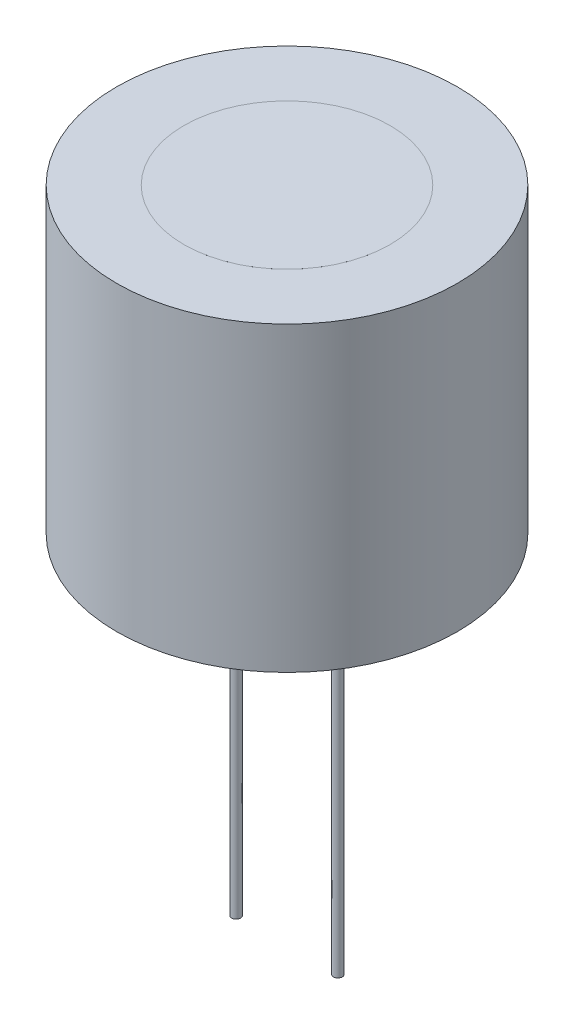
ISO-10303-21;
HEADER;
FILE_DESCRIPTION(('STEP AP214'),'2;1');
FILE_NAME('part.step','',(''),(''),'','','');
FILE_SCHEMA(('AUTOMOTIVE_DESIGN { 1 0 10303 214 1 1 1 1 }'));
ENDSEC;
DATA;
#1=APPLICATION_CONTEXT('core data for automotive mechanical design processes');
#2=APPLICATION_PROTOCOL_DEFINITION('international standard','automotive_design',2000,#1);
#3=PRODUCT_CONTEXT('',#1,'mechanical');
#4=PRODUCT('Part','Part','',(#3));
#5=PRODUCT_RELATED_PRODUCT_CATEGORY('part','',(#4));
#6=PRODUCT_DEFINITION_FORMATION('','',#4);
#7=PRODUCT_DEFINITION_CONTEXT('part definition',#1,'design');
#8=PRODUCT_DEFINITION('design','',#6,#7);
#9=PRODUCT_DEFINITION_SHAPE('','',#8);
#10=(LENGTH_UNIT() NAMED_UNIT(*) SI_UNIT(.MILLI.,.METRE.));
#11=(NAMED_UNIT(*) PLANE_ANGLE_UNIT() SI_UNIT($,.RADIAN.));
#12=(NAMED_UNIT(*) SI_UNIT($,.STERADIAN.) SOLID_ANGLE_UNIT());
#13=UNCERTAINTY_MEASURE_WITH_UNIT(LENGTH_MEASURE(1.E-05),#10,'distance_accuracy_value','');
#14=(GEOMETRIC_REPRESENTATION_CONTEXT(3) GLOBAL_UNCERTAINTY_ASSIGNED_CONTEXT((#13)) GLOBAL_UNIT_ASSIGNED_CONTEXT((#10,
#11,#12)) REPRESENTATION_CONTEXT('',''));
#15=CARTESIAN_POINT('',(0.,0.,0.));
#16=DIRECTION('',(0.,0.,1.));
#17=DIRECTION('',(1.,0.,0.));
#18=AXIS2_PLACEMENT_3D('',#15,#16,#17);
#19=CARTESIAN_POINT('',(0.,-15.0495,0.));
#20=DIRECTION('',(0.,1.,0.));
#21=DIRECTION('',(0.,0.,1.));
#22=AXIS2_PLACEMENT_3D('',#19,#20,#21);
#23=CYLINDRICAL_SURFACE('',#22,8.4963);
#24=CARTESIAN_POINT('',(0.,-15.0495,0.));
#25=DIRECTION('',(0.,1.,0.));
#26=DIRECTION('',(0.,0.,1.));
#27=AXIS2_PLACEMENT_3D('',#24,#25,#26);
#28=CIRCLE('',#27,8.4963);
#29=CARTESIAN_POINT('',(0.,-15.0495,8.4963));
#30=VERTEX_POINT('',#29);
#31=EDGE_CURVE('E44',#30,#30,#28,.T.);
#32=CARTESIAN_POINT('',(0.,0.,0.));
#33=DIRECTION('',(0.,1.,0.));
#34=DIRECTION('',(0.,0.,1.));
#35=AXIS2_PLACEMENT_3D('',#32,#33,#34);
#36=CIRCLE('',#35,8.4963);
#37=CARTESIAN_POINT('',(0.,0.,8.4963));
#38=VERTEX_POINT('',#37);
#39=EDGE_CURVE('E48',#38,#38,#36,.T.);
#40=CARTESIAN_POINT('',(0.,-15.0495,8.4963));
#41=CARTESIAN_POINT('',(0.,-14.892734375,8.4963));
#42=CARTESIAN_POINT('',(0.,-14.73596875,8.4963));
#43=CARTESIAN_POINT('',(0.,-14.4224375,8.4963));
#44=CARTESIAN_POINT('',(0.,-14.265671875,8.4963));
#45=CARTESIAN_POINT('',(0.,-13.952140625,8.4963));
#46=CARTESIAN_POINT('',(0.,-13.795375,8.4963));
#47=CARTESIAN_POINT('',(0.,-13.48184375,8.4963));
#48=CARTESIAN_POINT('',(0.,-13.325078125,8.4963));
#49=CARTESIAN_POINT('',(0.,-13.011546875,8.4963));
#50=CARTESIAN_POINT('',(0.,-12.85478125,8.4963));
#51=CARTESIAN_POINT('',(0.,-12.54125,8.4963));
#52=CARTESIAN_POINT('',(0.,-12.384484375,8.4963));
#53=CARTESIAN_POINT('',(0.,-12.070953125,8.4963));
#54=CARTESIAN_POINT('',(0.,-11.9141875,8.4963));
#55=CARTESIAN_POINT('',(0.,-11.60065625,8.4963));
#56=CARTESIAN_POINT('',(0.,-11.443890625,8.4963));
#57=CARTESIAN_POINT('',(0.,-11.130359375,8.4963));
#58=CARTESIAN_POINT('',(0.,-10.97359375,8.4963));
#59=CARTESIAN_POINT('',(0.,-10.6600625,8.4963));
#60=CARTESIAN_POINT('',(0.,-10.503296875,8.4963));
#61=CARTESIAN_POINT('',(0.,-10.189765625,8.4963));
#62=CARTESIAN_POINT('',(0.,-10.033,8.4963));
#63=CARTESIAN_POINT('',(0.,-9.71946875,8.4963));
#64=CARTESIAN_POINT('',(0.,-9.562703125,8.4963));
#65=CARTESIAN_POINT('',(0.,-9.249171875,8.4963));
#66=CARTESIAN_POINT('',(0.,-9.09240625,8.4963));
#67=CARTESIAN_POINT('',(0.,-8.778875,8.4963));
#68=CARTESIAN_POINT('',(0.,-8.622109375,8.4963));
#69=CARTESIAN_POINT('',(0.,-8.308578125,8.4963));
#70=CARTESIAN_POINT('',(0.,-8.1518125,8.4963));
#71=CARTESIAN_POINT('',(0.,-7.83828125,8.4963));
#72=CARTESIAN_POINT('',(0.,-7.681515625,8.4963));
#73=CARTESIAN_POINT('',(0.,-7.367984375,8.4963));
#74=CARTESIAN_POINT('',(0.,-7.21121875,8.4963));
#75=CARTESIAN_POINT('',(0.,-6.8976875,8.4963));
#76=CARTESIAN_POINT('',(0.,-6.740921875,8.4963));
#77=CARTESIAN_POINT('',(0.,-6.427390625,8.4963));
#78=CARTESIAN_POINT('',(0.,-6.270625,8.4963));
#79=CARTESIAN_POINT('',(0.,-5.95709375,8.4963));
#80=CARTESIAN_POINT('',(0.,-5.800328125,8.4963));
#81=CARTESIAN_POINT('',(0.,-5.486796875,8.4963));
#82=CARTESIAN_POINT('',(0.,-5.33003125,8.4963));
#83=CARTESIAN_POINT('',(0.,-5.0165,8.4963));
#84=CARTESIAN_POINT('',(0.,-4.859734375,8.4963));
#85=CARTESIAN_POINT('',(0.,-4.546203125,8.4963));
#86=CARTESIAN_POINT('',(0.,-4.3894375,8.4963));
#87=CARTESIAN_POINT('',(0.,-4.07590625,8.4963));
#88=CARTESIAN_POINT('',(0.,-3.919140625,8.4963));
#89=CARTESIAN_POINT('',(0.,-3.605609375,8.4963));
#90=CARTESIAN_POINT('',(0.,-3.44884375,8.4963));
#91=CARTESIAN_POINT('',(0.,-3.1353125,8.4963));
#92=CARTESIAN_POINT('',(0.,-2.978546875,8.4963));
#93=CARTESIAN_POINT('',(0.,-2.665015625,8.4963));
#94=CARTESIAN_POINT('',(0.,-2.50825,8.4963));
#95=CARTESIAN_POINT('',(0.,-2.19471875,8.4963));
#96=CARTESIAN_POINT('',(0.,-2.037953125,8.4963));
#97=CARTESIAN_POINT('',(0.,-1.724421875,8.4963));
#98=CARTESIAN_POINT('',(0.,-1.56765625,8.4963));
#99=CARTESIAN_POINT('',(0.,-1.254125,8.4963));
#100=CARTESIAN_POINT('',(0.,-1.097359375,8.4963));
#101=CARTESIAN_POINT('',(0.,-0.783828125000001,8.4963));
#102=CARTESIAN_POINT('',(0.,-0.627062500000002,8.4963));
#103=CARTESIAN_POINT('',(0.,-0.313531250000002,8.4963));
#104=CARTESIAN_POINT('',(0.,-0.156765625000002,8.4963));
#105=CARTESIAN_POINT('',(0.,0.,8.4963));
#106=B_SPLINE_CURVE_WITH_KNOTS('',3,(#40,#41,#42,#43,#44,#45,#46,#47,#48,#49,#50,#51,#52,#53,
#54,#55,#56,#57,#58,#59,#60,#61,#62,#63,#64,#65,#66,#67,#68,#69,#70,#71,#72,#73,#74,#75,#76,#77,
#78,#79,#80,#81,#82,#83,#84,#85,#86,#87,#88,#89,#90,#91,#92,#93,#94,#95,#96,#97,#98,#99,#100,
#101,#102,#103,#104,#105),.UNSPECIFIED.,.F.,.F.,(4,2,2,2,2,2,2,2,2,2,2,2,2,2,2,2,2,2,2,2,2,2,2,
2,2,2,2,2,2,2,2,2,4),(0.,0.470296875,0.94059375,1.410890625,1.8811875,2.351484375,2.82178125,
3.292078125,3.762375,4.232671875,4.70296875,5.173265625,5.6435625,6.113859375,6.58415625,
7.054453125,7.52475,7.995046875,8.46534375,8.935640625,9.4059375,9.876234375,10.34653125,
10.816828125,11.287125,11.757421875,12.22771875,12.698015625,13.1683125,13.638609375,
14.10890625,14.579203125,15.0495),.UNSPECIFIED.);
#107=EDGE_CURVE('BSEAM34',#30,#38,#106,.T.);
#108=ORIENTED_EDGE('',*,*,#31,.T.);
#109=ORIENTED_EDGE('',*,*,#39,.F.);
#110=ORIENTED_EDGE('',*,*,#107,.T.);
#111=ORIENTED_EDGE('',*,*,#107,.F.);
#112=EDGE_LOOP('',(#108,#110,#109,#111));
#113=FACE_BOUND('',#112,.T.);
#114=ADVANCED_FACE('F34',(#113),#23,.T.);
#115=CARTESIAN_POINT('',(0.,-15.0495,0.));
#116=DIRECTION('',(0.,1.,0.));
#117=DIRECTION('',(0.,0.,1.));
#118=AXIS2_PLACEMENT_3D('',#115,#116,#117);
#119=PLANE('',#118);
#120=CARTESIAN_POINT('',(2.54,-15.0495,0.));
#121=DIRECTION('',(0.,1.,0.));
#122=DIRECTION('',(0.,0.,1.));
#123=AXIS2_PLACEMENT_3D('',#120,#121,#122);
#124=CIRCLE('',#123,0.22225);
#125=CARTESIAN_POINT('',(2.54,-15.0495,0.22225));
#126=VERTEX_POINT('',#125);
#127=EDGE_CURVE('E10',#126,#126,#124,.F.);
#128=ORIENTED_EDGE('',*,*,#127,.F.);
#129=EDGE_LOOP('',(#128));
#130=FACE_BOUND('',#129,.T.);
#131=CARTESIAN_POINT('',(-2.54,-15.0495,0.));
#132=DIRECTION('',(0.,1.,0.));
#133=DIRECTION('',(0.,0.,1.));
#134=AXIS2_PLACEMENT_3D('',#131,#132,#133);
#135=CIRCLE('',#134,0.22225);
#136=CARTESIAN_POINT('',(-2.54,-15.0495,0.22225));
#137=VERTEX_POINT('',#136);
#138=EDGE_CURVE('E40',#137,#137,#135,.F.);
#139=ORIENTED_EDGE('',*,*,#138,.F.);
#140=EDGE_LOOP('',(#139));
#141=FACE_BOUND('',#140,.T.);
#142=ORIENTED_EDGE('',*,*,#31,.F.);
#143=EDGE_LOOP('',(#142));
#144=FACE_BOUND('',#143,.T.);
#145=ADVANCED_FACE('F79',(#130,#141,#144),#119,.F.);
#146=CARTESIAN_POINT('',(0.,0.,0.));
#147=DIRECTION('',(0.,1.,0.));
#148=DIRECTION('',(0.,0.,1.));
#149=AXIS2_PLACEMENT_3D('',#146,#147,#148);
#150=PLANE('',#149);
#151=CARTESIAN_POINT('',(0.,0.,0.));
#152=DIRECTION('',(0.,1.,0.));
#153=DIRECTION('',(0.,0.,1.));
#154=AXIS2_PLACEMENT_3D('',#151,#152,#153);
#155=CIRCLE('',#154,5.1435);
#156=CARTESIAN_POINT('',(0.,0.,5.1435));
#157=VERTEX_POINT('',#156);
#158=EDGE_CURVE('E60',#157,#157,#155,.T.);
#159=ORIENTED_EDGE('',*,*,#158,.F.);
#160=EDGE_LOOP('',(#159));
#161=FACE_BOUND('',#160,.T.);
#162=ORIENTED_EDGE('',*,*,#39,.T.);
#163=EDGE_LOOP('',(#162));
#164=FACE_BOUND('',#163,.T.);
#165=ADVANCED_FACE('F75',(#161,#164),#150,.T.);
#166=CARTESIAN_POINT('',(-2.54,-32.8295,0.));
#167=DIRECTION('',(0.,1.,0.));
#168=DIRECTION('',(0.,0.,1.));
#169=AXIS2_PLACEMENT_3D('',#166,#167,#168);
#170=CYLINDRICAL_SURFACE('',#169,0.22225);
#171=CARTESIAN_POINT('',(-2.54,-32.8295,0.));
#172=DIRECTION('',(0.,-1.,0.));
#173=DIRECTION('',(0.,0.,-1.));
#174=AXIS2_PLACEMENT_3D('',#171,#172,#173);
#175=CIRCLE('',#174,0.22225);
#176=CARTESIAN_POINT('',(-2.54,-32.8295,-0.22225));
#177=VERTEX_POINT('',#176);
#178=EDGE_CURVE('E52',#177,#177,#175,.T.);
#179=ORIENTED_EDGE('',*,*,#178,.F.);
#180=EDGE_LOOP('',(#179));
#181=FACE_BOUND('',#180,.T.);
#182=ORIENTED_EDGE('',*,*,#138,.T.);
#183=EDGE_LOOP('',(#182));
#184=FACE_BOUND('',#183,.T.);
#185=ADVANCED_FACE('F78',(#181,#184),#170,.T.);
#186=CARTESIAN_POINT('',(-2.54,-32.8295,0.));
#187=DIRECTION('',(0.,-1.,0.));
#188=DIRECTION('',(0.,0.,-1.));
#189=AXIS2_PLACEMENT_3D('',#186,#187,#188);
#190=PLANE('',#189);
#191=ORIENTED_EDGE('',*,*,#178,.T.);
#192=EDGE_LOOP('',(#191));
#193=FACE_BOUND('',#192,.T.);
#194=ADVANCED_FACE('F97',(#193),#190,.T.);
#195=CARTESIAN_POINT('',(2.54,-32.8295,0.));
#196=DIRECTION('',(0.,1.,0.));
#197=DIRECTION('',(0.,0.,1.));
#198=AXIS2_PLACEMENT_3D('',#195,#196,#197);
#199=CYLINDRICAL_SURFACE('',#198,0.22225);
#200=CARTESIAN_POINT('',(2.54,-32.8295,0.));
#201=DIRECTION('',(0.,-1.,0.));
#202=DIRECTION('',(0.,0.,-1.));
#203=AXIS2_PLACEMENT_3D('',#200,#201,#202);
#204=CIRCLE('',#203,0.22225);
#205=CARTESIAN_POINT('',(2.54,-32.8295,-0.22225));
#206=VERTEX_POINT('',#205);
#207=EDGE_CURVE('E56',#206,#206,#204,.T.);
#208=ORIENTED_EDGE('',*,*,#207,.F.);
#209=EDGE_LOOP('',(#208));
#210=FACE_BOUND('',#209,.T.);
#211=ORIENTED_EDGE('',*,*,#127,.T.);
#212=EDGE_LOOP('',(#211));
#213=FACE_BOUND('',#212,.T.);
#214=ADVANCED_FACE('F101',(#210,#213),#199,.T.);
#215=CARTESIAN_POINT('',(2.54,-32.8295,0.));
#216=DIRECTION('',(0.,-1.,0.));
#217=DIRECTION('',(0.,0.,-1.));
#218=AXIS2_PLACEMENT_3D('',#215,#216,#217);
#219=PLANE('',#218);
#220=ORIENTED_EDGE('',*,*,#207,.T.);
#221=EDGE_LOOP('',(#220));
#222=FACE_BOUND('',#221,.T.);
#223=ADVANCED_FACE('F71',(#222),#219,.T.);
#224=CARTESIAN_POINT('',(0.,0.000254,0.));
#225=DIRECTION('',(0.,-1.,0.));
#226=DIRECTION('',(0.,0.,-1.));
#227=AXIS2_PLACEMENT_3D('',#224,#225,#226);
#228=CYLINDRICAL_SURFACE('',#227,5.1435);
#229=CARTESIAN_POINT('',(0.,0.000254,0.));
#230=DIRECTION('',(0.,1.,0.));
#231=DIRECTION('',(0.,0.,1.));
#232=AXIS2_PLACEMENT_3D('',#229,#230,#231);
#233=CIRCLE('',#232,5.1435);
#234=CARTESIAN_POINT('',(0.,0.000254,5.1435));
#235=VERTEX_POINT('',#234);
#236=EDGE_CURVE('E59',#235,#235,#233,.T.);
#237=ORIENTED_EDGE('',*,*,#236,.F.);
#238=EDGE_LOOP('',(#237));
#239=FACE_BOUND('',#238,.T.);
#240=ORIENTED_EDGE('',*,*,#158,.T.);
#241=EDGE_LOOP('',(#240));
#242=FACE_BOUND('',#241,.T.);
#243=ADVANCED_FACE('F68',(#239,#242),#228,.T.);
#244=CARTESIAN_POINT('',(0.,0.000254,0.));
#245=DIRECTION('',(0.,1.,0.));
#246=DIRECTION('',(0.,0.,1.));
#247=AXIS2_PLACEMENT_3D('',#244,#245,#246);
#248=PLANE('',#247);
#249=ORIENTED_EDGE('',*,*,#236,.T.);
#250=EDGE_LOOP('',(#249));
#251=FACE_BOUND('',#250,.T.);
#252=ADVANCED_FACE('F66',(#251),#248,.T.);
#253=CLOSED_SHELL('',(#114,#145,#165,#185,#194,#214,#223,#243,#252));
#254=MANIFOLD_SOLID_BREP('B2',#253);
#255=ADVANCED_BREP_SHAPE_REPRESENTATION('',(#18,#254),#14);
#256=SHAPE_DEFINITION_REPRESENTATION(#9,#255);
ENDSEC;
END-ISO-10303-21;
